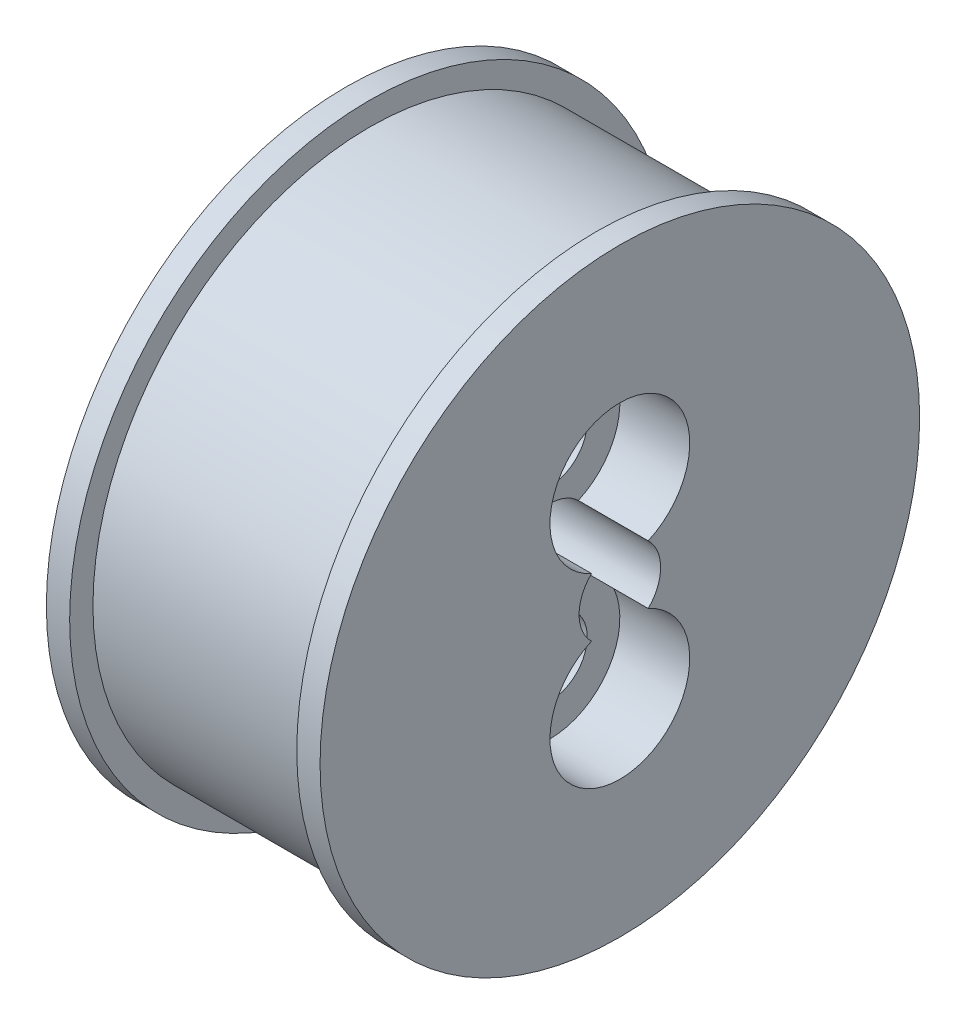
ISO-10303-21;
HEADER;
FILE_DESCRIPTION(('STEP AP214'),'2;1');
FILE_NAME('part.step','',(''),(''),'','','');
FILE_SCHEMA(('AUTOMOTIVE_DESIGN { 1 0 10303 214 1 1 1 1 }'));
ENDSEC;
DATA;
#1=APPLICATION_CONTEXT('core data for automotive mechanical design processes');
#2=APPLICATION_PROTOCOL_DEFINITION('international standard','automotive_design',2000,#1);
#3=PRODUCT_CONTEXT('',#1,'mechanical');
#4=PRODUCT('Part','Part','',(#3));
#5=PRODUCT_RELATED_PRODUCT_CATEGORY('part','',(#4));
#6=PRODUCT_DEFINITION_FORMATION('','',#4);
#7=PRODUCT_DEFINITION_CONTEXT('part definition',#1,'design');
#8=PRODUCT_DEFINITION('design','',#6,#7);
#9=PRODUCT_DEFINITION_SHAPE('','',#8);
#10=(LENGTH_UNIT() NAMED_UNIT(*) SI_UNIT(.MILLI.,.METRE.));
#11=(NAMED_UNIT(*) PLANE_ANGLE_UNIT() SI_UNIT($,.RADIAN.));
#12=(NAMED_UNIT(*) SI_UNIT($,.STERADIAN.) SOLID_ANGLE_UNIT());
#13=UNCERTAINTY_MEASURE_WITH_UNIT(LENGTH_MEASURE(1.E-05),#10,'distance_accuracy_value','');
#14=(GEOMETRIC_REPRESENTATION_CONTEXT(3) GLOBAL_UNCERTAINTY_ASSIGNED_CONTEXT((#13)) GLOBAL_UNIT_ASSIGNED_CONTEXT((#10,
#11,#12)) REPRESENTATION_CONTEXT('',''));
#15=CARTESIAN_POINT('',(0.,0.,0.));
#16=DIRECTION('',(0.,0.,1.));
#17=DIRECTION('',(1.,0.,0.));
#18=AXIS2_PLACEMENT_3D('',#15,#16,#17);
#19=CARTESIAN_POINT('',(0.,0.,0.));
#20=DIRECTION('',(-1.,0.,0.));
#21=DIRECTION('',(0.,-1.,0.));
#22=AXIS2_PLACEMENT_3D('',#19,#20,#21);
#23=PLANE('',#22);
#24=CARTESIAN_POINT('',(0.,-4.,0.));
#25=DIRECTION('',(1.,0.,0.));
#26=DIRECTION('',(0.,0.,-1.));
#27=AXIS2_PLACEMENT_3D('',#24,#25,#26);
#28=CIRCLE('',#27,1.6);
#29=CARTESIAN_POINT('',(0.,-4.,-1.6));
#30=VERTEX_POINT('',#29);
#31=EDGE_CURVE('E133',#30,#30,#28,.T.);
#32=ORIENTED_EDGE('',*,*,#31,.T.);
#33=EDGE_LOOP('',(#32));
#34=FACE_BOUND('',#33,.T.);
#35=CARTESIAN_POINT('',(0.,4.,0.));
#36=DIRECTION('',(1.,0.,0.));
#37=DIRECTION('',(0.,0.,-1.));
#38=AXIS2_PLACEMENT_3D('',#35,#36,#37);
#39=CIRCLE('',#38,1.6);
#40=CARTESIAN_POINT('',(0.,4.,-1.6));
#41=VERTEX_POINT('',#40);
#42=EDGE_CURVE('E93',#41,#41,#39,.T.);
#43=ORIENTED_EDGE('',*,*,#42,.T.);
#44=EDGE_LOOP('',(#43));
#45=FACE_BOUND('',#44,.T.);
#46=CARTESIAN_POINT('',(0.,0.,0.));
#47=DIRECTION('',(1.,0.,0.));
#48=DIRECTION('',(0.,1.,0.));
#49=AXIS2_PLACEMENT_3D('',#46,#47,#48);
#50=CIRCLE('',#49,1.75);
#51=CARTESIAN_POINT('',(0.,1.75,0.));
#52=VERTEX_POINT('',#51);
#53=EDGE_CURVE('E95',#52,#52,#50,.T.);
#54=ORIENTED_EDGE('',*,*,#53,.T.);
#55=EDGE_LOOP('',(#54));
#56=FACE_BOUND('',#55,.T.);
#57=CARTESIAN_POINT('',(0.,0.,0.));
#58=DIRECTION('',(1.,0.,0.));
#59=DIRECTION('',(0.,1.,0.));
#60=AXIS2_PLACEMENT_3D('',#57,#58,#59);
#61=CIRCLE('',#60,12.87);
#62=CARTESIAN_POINT('',(0.,12.87,0.));
#63=VERTEX_POINT('',#62);
#64=EDGE_CURVE('E116',#63,#63,#61,.T.);
#65=ORIENTED_EDGE('',*,*,#64,.F.);
#66=EDGE_LOOP('',(#65));
#67=FACE_BOUND('',#66,.T.);
#68=ADVANCED_FACE('F35',(#34,#45,#56,#67),#23,.T.);
#69=CARTESIAN_POINT('',(11.75,0.,0.));
#70=DIRECTION('',(1.,0.,0.));
#71=DIRECTION('',(0.,1.,0.));
#72=AXIS2_PLACEMENT_3D('',#69,#70,#71);
#73=CYLINDRICAL_SURFACE('',#72,12.87);
#74=ORIENTED_EDGE('',*,*,#64,.T.);
#75=EDGE_LOOP('',(#74));
#76=FACE_BOUND('',#75,.T.);
#77=CARTESIAN_POINT('',(1.,0.,0.));
#78=DIRECTION('',(1.,0.,0.));
#79=DIRECTION('',(0.,1.,0.));
#80=AXIS2_PLACEMENT_3D('',#77,#78,#79);
#81=CIRCLE('',#80,12.87);
#82=CARTESIAN_POINT('',(1.,12.87,0.));
#83=VERTEX_POINT('',#82);
#84=EDGE_CURVE('E113',#83,#83,#81,.T.);
#85=ORIENTED_EDGE('',*,*,#84,.F.);
#86=EDGE_LOOP('',(#85));
#87=FACE_BOUND('',#86,.T.);
#88=ADVANCED_FACE('F158',(#76,#87),#73,.T.);
#89=CARTESIAN_POINT('',(1.,12.87,0.));
#90=DIRECTION('',(1.,0.,0.));
#91=DIRECTION('',(0.,1.,0.));
#92=AXIS2_PLACEMENT_3D('',#89,#90,#91);
#93=PLANE('',#92);
#94=ORIENTED_EDGE('',*,*,#84,.T.);
#95=EDGE_LOOP('',(#94));
#96=FACE_BOUND('',#95,.T.);
#97=CARTESIAN_POINT('',(1.,0.,0.));
#98=DIRECTION('',(1.,0.,0.));
#99=DIRECTION('',(0.,1.,0.));
#100=AXIS2_PLACEMENT_3D('',#97,#98,#99);
#101=CIRCLE('',#100,11.87);
#102=CARTESIAN_POINT('',(1.,11.87,0.));
#103=VERTEX_POINT('',#102);
#104=EDGE_CURVE('E110',#103,#103,#101,.T.);
#105=ORIENTED_EDGE('',*,*,#104,.F.);
#106=EDGE_LOOP('',(#105));
#107=FACE_BOUND('',#106,.T.);
#108=ADVANCED_FACE('F163',(#96,#107),#93,.T.);
#109=CARTESIAN_POINT('',(11.75,0.,0.));
#110=DIRECTION('',(1.,0.,0.));
#111=DIRECTION('',(0.,1.,0.));
#112=AXIS2_PLACEMENT_3D('',#109,#110,#111);
#113=CYLINDRICAL_SURFACE('',#112,11.87);
#114=ORIENTED_EDGE('',*,*,#104,.T.);
#115=EDGE_LOOP('',(#114));
#116=FACE_BOUND('',#115,.T.);
#117=CARTESIAN_POINT('',(10.75,0.,0.));
#118=DIRECTION('',(1.,0.,0.));
#119=DIRECTION('',(0.,1.,0.));
#120=AXIS2_PLACEMENT_3D('',#117,#118,#119);
#121=CIRCLE('',#120,11.87);
#122=CARTESIAN_POINT('',(10.75,11.87,0.));
#123=VERTEX_POINT('',#122);
#124=EDGE_CURVE('E107',#123,#123,#121,.T.);
#125=ORIENTED_EDGE('',*,*,#124,.F.);
#126=EDGE_LOOP('',(#125));
#127=FACE_BOUND('',#126,.T.);
#128=ADVANCED_FACE('F178',(#116,#127),#113,.T.);
#129=CARTESIAN_POINT('',(10.75,11.87,0.));
#130=DIRECTION('',(-1.,0.,0.));
#131=DIRECTION('',(0.,-1.,0.));
#132=AXIS2_PLACEMENT_3D('',#129,#130,#131);
#133=PLANE('',#132);
#134=ORIENTED_EDGE('',*,*,#124,.T.);
#135=EDGE_LOOP('',(#134));
#136=FACE_BOUND('',#135,.T.);
#137=CARTESIAN_POINT('',(10.75,0.,0.));
#138=DIRECTION('',(1.,0.,0.));
#139=DIRECTION('',(0.,1.,0.));
#140=AXIS2_PLACEMENT_3D('',#137,#138,#139);
#141=CIRCLE('',#140,12.87);
#142=CARTESIAN_POINT('',(10.75,12.87,0.));
#143=VERTEX_POINT('',#142);
#144=EDGE_CURVE('E104',#143,#143,#141,.T.);
#145=ORIENTED_EDGE('',*,*,#144,.F.);
#146=EDGE_LOOP('',(#145));
#147=FACE_BOUND('',#146,.T.);
#148=ADVANCED_FACE('F184',(#136,#147),#133,.T.);
#149=CARTESIAN_POINT('',(11.75,0.,0.));
#150=DIRECTION('',(1.,0.,0.));
#151=DIRECTION('',(0.,1.,0.));
#152=AXIS2_PLACEMENT_3D('',#149,#150,#151);
#153=CYLINDRICAL_SURFACE('',#152,12.87);
#154=ORIENTED_EDGE('',*,*,#144,.T.);
#155=EDGE_LOOP('',(#154));
#156=FACE_BOUND('',#155,.T.);
#157=CARTESIAN_POINT('',(11.75,0.,0.));
#158=DIRECTION('',(1.,0.,0.));
#159=DIRECTION('',(0.,1.,0.));
#160=AXIS2_PLACEMENT_3D('',#157,#158,#159);
#161=CIRCLE('',#160,12.87);
#162=CARTESIAN_POINT('',(11.75,12.87,0.));
#163=VERTEX_POINT('',#162);
#164=EDGE_CURVE('E101',#163,#163,#161,.T.);
#165=ORIENTED_EDGE('',*,*,#164,.F.);
#166=EDGE_LOOP('',(#165));
#167=FACE_BOUND('',#166,.T.);
#168=ADVANCED_FACE('F190',(#156,#167),#153,.T.);
#169=CARTESIAN_POINT('',(11.75,12.87,0.));
#170=DIRECTION('',(1.,0.,0.));
#171=DIRECTION('',(0.,1.,0.));
#172=AXIS2_PLACEMENT_3D('',#169,#170,#171);
#173=PLANE('',#172);
#174=CARTESIAN_POINT('',(11.75,-4.,0.));
#175=DIRECTION('',(1.,0.,0.));
#176=DIRECTION('',(0.,0.,-1.));
#177=AXIS2_PLACEMENT_3D('',#174,#175,#176);
#178=CIRCLE('',#177,3.);
#179=CARTESIAN_POINT('',(11.75,-1.2578125,1.21672006428913));
#180=VERTEX_POINT('',#179);
#181=CARTESIAN_POINT('',(11.75,-1.2578125,-1.21672006428913));
#182=VERTEX_POINT('',#181);
#183=EDGE_CURVE('E74',#180,#182,#178,.T.);
#184=ORIENTED_EDGE('',*,*,#183,.F.);
#185=CARTESIAN_POINT('',(11.75,0.,0.));
#186=DIRECTION('',(1.,0.,0.));
#187=DIRECTION('',(0.,1.,0.));
#188=AXIS2_PLACEMENT_3D('',#185,#186,#187);
#189=CIRCLE('',#188,1.75);
#190=CARTESIAN_POINT('',(11.75,1.2578125,1.21672006428913));
#191=VERTEX_POINT('',#190);
#192=EDGE_CURVE('E92',#191,#180,#189,.T.);
#193=ORIENTED_EDGE('',*,*,#192,.F.);
#194=CARTESIAN_POINT('',(11.75,4.,0.));
#195=DIRECTION('',(1.,0.,0.));
#196=DIRECTION('',(0.,0.,-1.));
#197=AXIS2_PLACEMENT_3D('',#194,#195,#196);
#198=CIRCLE('',#197,3.);
#199=CARTESIAN_POINT('',(11.75,1.2578125,-1.21672006428913));
#200=VERTEX_POINT('',#199);
#201=EDGE_CURVE('E91',#200,#191,#198,.T.);
#202=ORIENTED_EDGE('',*,*,#201,.F.);
#203=EDGE_CURVE('E87',#182,#200,#189,.T.);
#204=ORIENTED_EDGE('',*,*,#203,.F.);
#205=EDGE_LOOP('',(#184,#193,#202,#204));
#206=FACE_BOUND('',#205,.T.);
#207=ORIENTED_EDGE('',*,*,#164,.T.);
#208=EDGE_LOOP('',(#207));
#209=FACE_BOUND('',#208,.T.);
#210=ADVANCED_FACE('F89',(#206,#209),#173,.T.);
#211=CARTESIAN_POINT('',(0.,0.,0.));
#212=DIRECTION('',(1.,0.,0.));
#213=DIRECTION('',(0.,1.,0.));
#214=AXIS2_PLACEMENT_3D('',#211,#212,#213);
#215=CYLINDRICAL_SURFACE('',#214,1.75);
#216=ORIENTED_EDGE('',*,*,#53,.F.);
#217=EDGE_LOOP('',(#216));
#218=FACE_BOUND('',#217,.T.);
#219=CARTESIAN_POINT('',(8.75,0.,0.));
#220=DIRECTION('',(-1.,0.,0.));
#221=DIRECTION('',(0.,0.,1.));
#222=AXIS2_PLACEMENT_3D('',#219,#220,#221);
#223=CIRCLE('',#222,1.75);
#224=CARTESIAN_POINT('',(8.75,-1.2578125,1.21672006428913));
#225=VERTEX_POINT('',#224);
#226=CARTESIAN_POINT('',(8.75,-1.2578125,-1.21672006428913));
#227=VERTEX_POINT('',#226);
#228=EDGE_CURVE('E42',#225,#227,#223,.F.);
#229=ORIENTED_EDGE('',*,*,#228,.T.);
#230=DIRECTION('',(1.,0.,0.));
#231=VECTOR('',#230,1.);
#232=CARTESIAN_POINT('',(10.25,-1.2578125,-1.21672006428913));
#233=LINE('',#232,#231);
#234=EDGE_CURVE('E11',#227,#182,#233,.T.);
#235=ORIENTED_EDGE('',*,*,#234,.T.);
#236=ORIENTED_EDGE('',*,*,#203,.T.);
#237=DIRECTION('',(1.,0.,0.));
#238=VECTOR('',#237,1.);
#239=CARTESIAN_POINT('',(10.25,1.2578125,-1.21672006428913));
#240=LINE('',#239,#238);
#241=CARTESIAN_POINT('',(8.75,1.2578125,-1.21672006428913));
#242=VERTEX_POINT('',#241);
#243=EDGE_CURVE('E119',#200,#242,#240,.F.);
#244=ORIENTED_EDGE('',*,*,#243,.T.);
#245=CARTESIAN_POINT('',(8.75,0.,0.));
#246=DIRECTION('',(-1.,0.,0.));
#247=DIRECTION('',(0.,0.,1.));
#248=AXIS2_PLACEMENT_3D('',#245,#246,#247);
#249=CIRCLE('',#248,1.75);
#250=CARTESIAN_POINT('',(8.75,1.2578125,1.21672006428913));
#251=VERTEX_POINT('',#250);
#252=EDGE_CURVE('E121',#242,#251,#249,.F.);
#253=ORIENTED_EDGE('',*,*,#252,.T.);
#254=DIRECTION('',(1.,0.,0.));
#255=VECTOR('',#254,1.);
#256=CARTESIAN_POINT('',(10.25,1.2578125,1.21672006428913));
#257=LINE('',#256,#255);
#258=EDGE_CURVE('E124',#251,#191,#257,.T.);
#259=ORIENTED_EDGE('',*,*,#258,.T.);
#260=ORIENTED_EDGE('',*,*,#192,.T.);
#261=DIRECTION('',(1.,0.,0.));
#262=VECTOR('',#261,1.);
#263=CARTESIAN_POINT('',(10.25,-1.2578125,1.21672006428913));
#264=LINE('',#263,#262);
#265=EDGE_CURVE('E77',#180,#225,#264,.F.);
#266=ORIENTED_EDGE('',*,*,#265,.T.);
#267=EDGE_LOOP('',(#229,#235,#236,#244,#253,#259,#260,#266));
#268=FACE_BOUND('',#267,.T.);
#269=ADVANCED_FACE('F85',(#218,#268),#215,.F.);
#270=CARTESIAN_POINT('',(8.75,5.6,0.));
#271=DIRECTION('',(-1.,0.,0.));
#272=DIRECTION('',(0.,0.,1.));
#273=AXIS2_PLACEMENT_3D('',#270,#271,#272);
#274=PLANE('',#273);
#275=CARTESIAN_POINT('',(8.75,4.,0.));
#276=DIRECTION('',(1.,0.,0.));
#277=DIRECTION('',(0.,0.,-1.));
#278=AXIS2_PLACEMENT_3D('',#275,#276,#277);
#279=CIRCLE('',#278,1.6);
#280=CARTESIAN_POINT('',(8.75,4.,-1.6));
#281=VERTEX_POINT('',#280);
#282=EDGE_CURVE('E97',#281,#281,#279,.T.);
#283=ORIENTED_EDGE('',*,*,#282,.F.);
#284=EDGE_LOOP('',(#283));
#285=FACE_BOUND('',#284,.T.);
#286=CARTESIAN_POINT('',(8.75,4.,0.));
#287=DIRECTION('',(1.,0.,0.));
#288=DIRECTION('',(0.,0.,-1.));
#289=AXIS2_PLACEMENT_3D('',#286,#287,#288);
#290=CIRCLE('',#289,3.);
#291=EDGE_CURVE('E57',#242,#251,#290,.T.);
#292=ORIENTED_EDGE('',*,*,#291,.T.);
#293=ORIENTED_EDGE('',*,*,#252,.F.);
#294=EDGE_LOOP('',(#292,#293));
#295=FACE_BOUND('',#294,.T.);
#296=ADVANCED_FACE('F129',(#285,#295),#274,.F.);
#297=CARTESIAN_POINT('',(11.75,4.,0.));
#298=DIRECTION('',(1.,0.,0.));
#299=DIRECTION('',(0.,0.,-1.));
#300=AXIS2_PLACEMENT_3D('',#297,#298,#299);
#301=CYLINDRICAL_SURFACE('',#300,3.);
#302=ORIENTED_EDGE('',*,*,#291,.F.);
#303=ORIENTED_EDGE('',*,*,#243,.F.);
#304=ORIENTED_EDGE('',*,*,#201,.T.);
#305=ORIENTED_EDGE('',*,*,#258,.F.);
#306=EDGE_LOOP('',(#302,#303,#304,#305));
#307=FACE_BOUND('',#306,.T.);
#308=ADVANCED_FACE('F127',(#307),#301,.F.);
#309=CARTESIAN_POINT('',(11.75,4.,0.));
#310=DIRECTION('',(1.,0.,0.));
#311=DIRECTION('',(0.,0.,-1.));
#312=AXIS2_PLACEMENT_3D('',#309,#310,#311);
#313=CYLINDRICAL_SURFACE('',#312,1.6);
#314=ORIENTED_EDGE('',*,*,#42,.F.);
#315=EDGE_LOOP('',(#314));
#316=FACE_BOUND('',#315,.T.);
#317=ORIENTED_EDGE('',*,*,#282,.T.);
#318=EDGE_LOOP('',(#317));
#319=FACE_BOUND('',#318,.T.);
#320=ADVANCED_FACE('F144',(#316,#319),#313,.F.);
#321=CARTESIAN_POINT('',(8.75,-2.4,0.));
#322=DIRECTION('',(-1.,0.,0.));
#323=DIRECTION('',(0.,0.,1.));
#324=AXIS2_PLACEMENT_3D('',#321,#322,#323);
#325=PLANE('',#324);
#326=CARTESIAN_POINT('',(8.75,-4.,0.));
#327=DIRECTION('',(1.,0.,0.));
#328=DIRECTION('',(0.,0.,-1.));
#329=AXIS2_PLACEMENT_3D('',#326,#327,#328);
#330=CIRCLE('',#329,1.6);
#331=CARTESIAN_POINT('',(8.75,-4.,-1.6));
#332=VERTEX_POINT('',#331);
#333=EDGE_CURVE('E138',#332,#332,#330,.T.);
#334=ORIENTED_EDGE('',*,*,#333,.F.);
#335=EDGE_LOOP('',(#334));
#336=FACE_BOUND('',#335,.T.);
#337=CARTESIAN_POINT('',(8.75,-4.,0.));
#338=DIRECTION('',(1.,0.,0.));
#339=DIRECTION('',(0.,0.,-1.));
#340=AXIS2_PLACEMENT_3D('',#337,#338,#339);
#341=CIRCLE('',#340,3.);
#342=EDGE_CURVE('E49',#225,#227,#341,.T.);
#343=ORIENTED_EDGE('',*,*,#342,.T.);
#344=ORIENTED_EDGE('',*,*,#228,.F.);
#345=EDGE_LOOP('',(#343,#344));
#346=FACE_BOUND('',#345,.T.);
#347=ADVANCED_FACE('F142',(#336,#346),#325,.F.);
#348=CARTESIAN_POINT('',(11.75,-4.,0.));
#349=DIRECTION('',(1.,0.,0.));
#350=DIRECTION('',(0.,0.,-1.));
#351=AXIS2_PLACEMENT_3D('',#348,#349,#350);
#352=CYLINDRICAL_SURFACE('',#351,3.);
#353=ORIENTED_EDGE('',*,*,#342,.F.);
#354=ORIENTED_EDGE('',*,*,#265,.F.);
#355=ORIENTED_EDGE('',*,*,#183,.T.);
#356=ORIENTED_EDGE('',*,*,#234,.F.);
#357=EDGE_LOOP('',(#353,#354,#355,#356));
#358=FACE_BOUND('',#357,.T.);
#359=ADVANCED_FACE('F75',(#358),#352,.F.);
#360=CARTESIAN_POINT('',(11.75,-4.,0.));
#361=DIRECTION('',(1.,0.,0.));
#362=DIRECTION('',(0.,0.,-1.));
#363=AXIS2_PLACEMENT_3D('',#360,#361,#362);
#364=CYLINDRICAL_SURFACE('',#363,1.6);
#365=ORIENTED_EDGE('',*,*,#31,.F.);
#366=EDGE_LOOP('',(#365));
#367=FACE_BOUND('',#366,.T.);
#368=ORIENTED_EDGE('',*,*,#333,.T.);
#369=EDGE_LOOP('',(#368));
#370=FACE_BOUND('',#369,.T.);
#371=ADVANCED_FACE('F151',(#367,#370),#364,.F.);
#372=CLOSED_SHELL('',(#68,#88,#108,#128,#148,#168,#210,#269,#296,#308,#320,#347,#359,#371));
#373=MANIFOLD_SOLID_BREP('B2',#372);
#374=ADVANCED_BREP_SHAPE_REPRESENTATION('',(#18,#373),#14);
#375=SHAPE_DEFINITION_REPRESENTATION(#9,#374);
ENDSEC;
END-ISO-10303-21;
